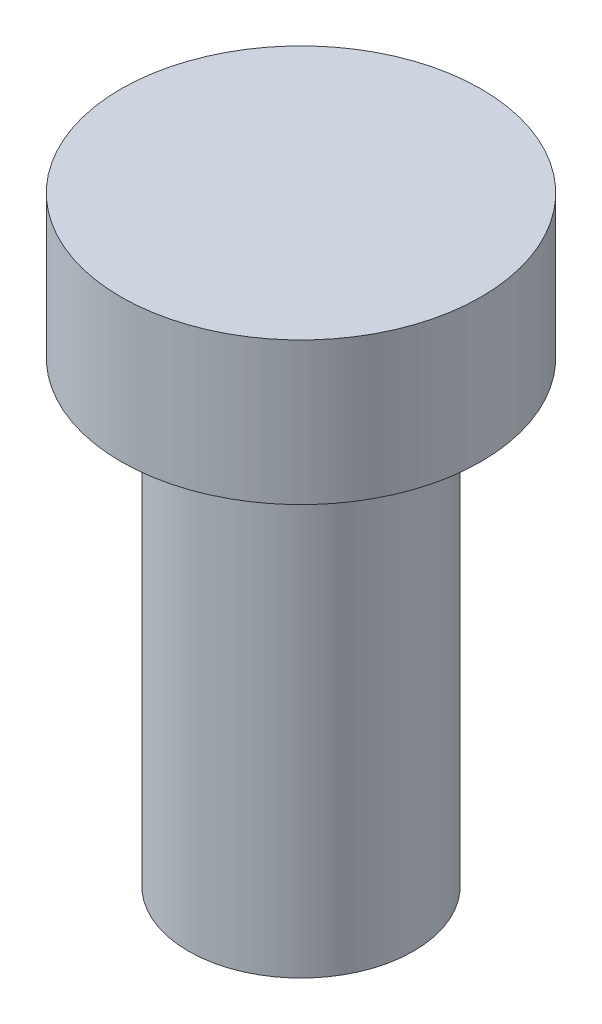
ISO-10303-21;
HEADER;
FILE_DESCRIPTION(('STEP AP214'),'2;1');
FILE_NAME('part.step','',(''),(''),'','','');
FILE_SCHEMA(('AUTOMOTIVE_DESIGN { 1 0 10303 214 1 1 1 1 }'));
ENDSEC;
DATA;
#1=APPLICATION_CONTEXT('core data for automotive mechanical design processes');
#2=APPLICATION_PROTOCOL_DEFINITION('international standard','automotive_design',2000,#1);
#3=PRODUCT_CONTEXT('',#1,'mechanical');
#4=PRODUCT('Part','Part','',(#3));
#5=PRODUCT_RELATED_PRODUCT_CATEGORY('part','',(#4));
#6=PRODUCT_DEFINITION_FORMATION('','',#4);
#7=PRODUCT_DEFINITION_CONTEXT('part definition',#1,'design');
#8=PRODUCT_DEFINITION('design','',#6,#7);
#9=PRODUCT_DEFINITION_SHAPE('','',#8);
#10=(LENGTH_UNIT() NAMED_UNIT(*) SI_UNIT(.MILLI.,.METRE.));
#11=(NAMED_UNIT(*) PLANE_ANGLE_UNIT() SI_UNIT($,.RADIAN.));
#12=(NAMED_UNIT(*) SI_UNIT($,.STERADIAN.) SOLID_ANGLE_UNIT());
#13=UNCERTAINTY_MEASURE_WITH_UNIT(LENGTH_MEASURE(1.E-05),#10,'distance_accuracy_value','');
#14=(GEOMETRIC_REPRESENTATION_CONTEXT(3) GLOBAL_UNCERTAINTY_ASSIGNED_CONTEXT((#13)) GLOBAL_UNIT_ASSIGNED_CONTEXT((#10,
#11,#12)) REPRESENTATION_CONTEXT('',''));
#15=CARTESIAN_POINT('',(0.,0.,0.));
#16=DIRECTION('',(0.,0.,1.));
#17=DIRECTION('',(1.,0.,0.));
#18=AXIS2_PLACEMENT_3D('',#15,#16,#17);
#19=CARTESIAN_POINT('',(0.,1.9,0.));
#20=DIRECTION('',(0.,-1.,0.));
#21=DIRECTION('',(0.,0.,-1.));
#22=AXIS2_PLACEMENT_3D('',#19,#20,#21);
#23=CYLINDRICAL_SURFACE('',#22,2.4);
#24=CARTESIAN_POINT('',(0.,1.9,0.));
#25=DIRECTION('',(0.,1.,0.));
#26=DIRECTION('',(0.,0.,1.));
#27=AXIS2_PLACEMENT_3D('',#24,#25,#26);
#28=CIRCLE('',#27,2.4);
#29=CARTESIAN_POINT('',(0.,1.9,-2.4));
#30=VERTEX_POINT('',#29);
#31=EDGE_CURVE('E37',#30,#30,#28,.T.);
#32=CARTESIAN_POINT('',(0.,0.,0.));
#33=DIRECTION('',(0.,1.,0.));
#34=DIRECTION('',(0.,0.,1.));
#35=AXIS2_PLACEMENT_3D('',#32,#33,#34);
#36=CIRCLE('',#35,2.4);
#37=CARTESIAN_POINT('',(0.,0.,-2.4));
#38=VERTEX_POINT('',#37);
#39=EDGE_CURVE('E33',#38,#38,#36,.T.);
#40=CARTESIAN_POINT('',(0.,1.9,-2.4));
#41=CARTESIAN_POINT('',(0.,1.88020833333333,-2.4));
#42=CARTESIAN_POINT('',(0.,1.86041666666667,-2.4));
#43=CARTESIAN_POINT('',(0.,1.82083333333333,-2.4));
#44=CARTESIAN_POINT('',(0.,1.80104166666667,-2.4));
#45=CARTESIAN_POINT('',(0.,1.76145833333333,-2.4));
#46=CARTESIAN_POINT('',(0.,1.74166666666667,-2.4));
#47=CARTESIAN_POINT('',(0.,1.70208333333333,-2.4));
#48=CARTESIAN_POINT('',(0.,1.68229166666667,-2.4));
#49=CARTESIAN_POINT('',(0.,1.64270833333333,-2.4));
#50=CARTESIAN_POINT('',(0.,1.62291666666667,-2.4));
#51=CARTESIAN_POINT('',(0.,1.58333333333333,-2.4));
#52=CARTESIAN_POINT('',(0.,1.56354166666667,-2.4));
#53=CARTESIAN_POINT('',(0.,1.52395833333333,-2.4));
#54=CARTESIAN_POINT('',(0.,1.50416666666667,-2.4));
#55=CARTESIAN_POINT('',(0.,1.46458333333333,-2.4));
#56=CARTESIAN_POINT('',(0.,1.44479166666667,-2.4));
#57=CARTESIAN_POINT('',(0.,1.40520833333333,-2.4));
#58=CARTESIAN_POINT('',(0.,1.38541666666667,-2.4));
#59=CARTESIAN_POINT('',(0.,1.34583333333333,-2.4));
#60=CARTESIAN_POINT('',(0.,1.32604166666667,-2.4));
#61=CARTESIAN_POINT('',(0.,1.28645833333333,-2.4));
#62=CARTESIAN_POINT('',(0.,1.26666666666667,-2.4));
#63=CARTESIAN_POINT('',(0.,1.22708333333333,-2.4));
#64=CARTESIAN_POINT('',(0.,1.20729166666667,-2.4));
#65=CARTESIAN_POINT('',(0.,1.16770833333333,-2.4));
#66=CARTESIAN_POINT('',(0.,1.14791666666667,-2.4));
#67=CARTESIAN_POINT('',(0.,1.10833333333333,-2.4));
#68=CARTESIAN_POINT('',(0.,1.08854166666667,-2.4));
#69=CARTESIAN_POINT('',(0.,1.04895833333333,-2.4));
#70=CARTESIAN_POINT('',(0.,1.02916666666667,-2.4));
#71=CARTESIAN_POINT('',(0.,0.989583333333333,-2.4));
#72=CARTESIAN_POINT('',(0.,0.969791666666667,-2.4));
#73=CARTESIAN_POINT('',(0.,0.930208333333333,-2.4));
#74=CARTESIAN_POINT('',(0.,0.910416666666667,-2.4));
#75=CARTESIAN_POINT('',(0.,0.870833333333333,-2.4));
#76=CARTESIAN_POINT('',(0.,0.851041666666667,-2.4));
#77=CARTESIAN_POINT('',(0.,0.811458333333333,-2.4));
#78=CARTESIAN_POINT('',(0.,0.791666666666667,-2.4));
#79=CARTESIAN_POINT('',(0.,0.752083333333333,-2.4));
#80=CARTESIAN_POINT('',(0.,0.732291666666667,-2.4));
#81=CARTESIAN_POINT('',(0.,0.692708333333333,-2.4));
#82=CARTESIAN_POINT('',(0.,0.672916666666667,-2.4));
#83=CARTESIAN_POINT('',(0.,0.633333333333333,-2.4));
#84=CARTESIAN_POINT('',(0.,0.613541666666667,-2.4));
#85=CARTESIAN_POINT('',(0.,0.573958333333333,-2.4));
#86=CARTESIAN_POINT('',(0.,0.554166666666667,-2.4));
#87=CARTESIAN_POINT('',(0.,0.514583333333333,-2.4));
#88=CARTESIAN_POINT('',(0.,0.494791666666667,-2.4));
#89=CARTESIAN_POINT('',(0.,0.455208333333333,-2.4));
#90=CARTESIAN_POINT('',(0.,0.435416666666667,-2.4));
#91=CARTESIAN_POINT('',(0.,0.395833333333333,-2.4));
#92=CARTESIAN_POINT('',(0.,0.376041666666667,-2.4));
#93=CARTESIAN_POINT('',(0.,0.336458333333333,-2.4));
#94=CARTESIAN_POINT('',(0.,0.316666666666667,-2.4));
#95=CARTESIAN_POINT('',(0.,0.277083333333333,-2.4));
#96=CARTESIAN_POINT('',(0.,0.257291666666667,-2.4));
#97=CARTESIAN_POINT('',(0.,0.217708333333333,-2.4));
#98=CARTESIAN_POINT('',(0.,0.197916666666667,-2.4));
#99=CARTESIAN_POINT('',(0.,0.158333333333333,-2.4));
#100=CARTESIAN_POINT('',(0.,0.138541666666667,-2.4));
#101=CARTESIAN_POINT('',(0.,0.0989583333333333,-2.4));
#102=CARTESIAN_POINT('',(0.,0.0791666666666666,-2.4));
#103=CARTESIAN_POINT('',(0.,0.0395833333333333,-2.4));
#104=CARTESIAN_POINT('',(0.,0.0197916666666666,-2.4));
#105=CARTESIAN_POINT('',(0.,0.,-2.4));
#106=B_SPLINE_CURVE_WITH_KNOTS('',3,(#40,#41,#42,#43,#44,#45,#46,#47,#48,#49,#50,#51,#52,#53,
#54,#55,#56,#57,#58,#59,#60,#61,#62,#63,#64,#65,#66,#67,#68,#69,#70,#71,#72,#73,#74,#75,#76,#77,
#78,#79,#80,#81,#82,#83,#84,#85,#86,#87,#88,#89,#90,#91,#92,#93,#94,#95,#96,#97,#98,#99,#100,
#101,#102,#103,#104,#105),.UNSPECIFIED.,.F.,.F.,(4,2,2,2,2,2,2,2,2,2,2,2,2,2,2,2,2,2,2,2,2,2,2,
2,2,2,2,2,2,2,2,2,4),(0.,0.059375,0.11875,0.178125,0.2375,0.296875,0.35625,0.415625,0.475,
0.534375,0.59375,0.653125,0.7125,0.771875,0.83125,0.890625,0.95,1.009375,1.06875,1.128125,
1.1875,1.246875,1.30625,1.365625,1.425,1.484375,1.54375,1.603125,1.6625,1.721875,1.78125,
1.840625,1.9),.UNSPECIFIED.);
#107=EDGE_CURVE('BSEAM30',#30,#38,#106,.T.);
#108=ORIENTED_EDGE('',*,*,#31,.F.);
#109=ORIENTED_EDGE('',*,*,#39,.T.);
#110=ORIENTED_EDGE('',*,*,#107,.T.);
#111=ORIENTED_EDGE('',*,*,#107,.F.);
#112=EDGE_LOOP('',(#108,#110,#109,#111));
#113=FACE_BOUND('',#112,.T.);
#114=ADVANCED_FACE('F30',(#113),#23,.T.);
#115=CARTESIAN_POINT('',(0.,1.9,0.));
#116=DIRECTION('',(0.,1.,0.));
#117=DIRECTION('',(0.,0.,1.));
#118=AXIS2_PLACEMENT_3D('',#115,#116,#117);
#119=PLANE('',#118);
#120=ORIENTED_EDGE('',*,*,#31,.T.);
#121=EDGE_LOOP('',(#120));
#122=FACE_BOUND('',#121,.T.);
#123=ADVANCED_FACE('F54',(#122),#119,.T.);
#124=CARTESIAN_POINT('',(0.,0.,0.));
#125=DIRECTION('',(0.,1.,0.));
#126=DIRECTION('',(0.,0.,1.));
#127=AXIS2_PLACEMENT_3D('',#124,#125,#126);
#128=PLANE('',#127);
#129=CARTESIAN_POINT('',(0.,0.,0.));
#130=DIRECTION('',(0.,-1.,0.));
#131=DIRECTION('',(0.,0.,-1.));
#132=AXIS2_PLACEMENT_3D('',#129,#130,#131);
#133=CIRCLE('',#132,1.5);
#134=CARTESIAN_POINT('',(0.,0.,-1.5));
#135=VERTEX_POINT('',#134);
#136=EDGE_CURVE('E10',#135,#135,#133,.T.);
#137=ORIENTED_EDGE('',*,*,#136,.F.);
#138=EDGE_LOOP('',(#137));
#139=FACE_BOUND('',#138,.T.);
#140=ORIENTED_EDGE('',*,*,#39,.F.);
#141=EDGE_LOOP('',(#140));
#142=FACE_BOUND('',#141,.T.);
#143=ADVANCED_FACE('F51',(#139,#142),#128,.F.);
#144=CARTESIAN_POINT('',(0.,-6.1,0.));
#145=DIRECTION('',(0.,1.,0.));
#146=DIRECTION('',(0.,0.,1.));
#147=AXIS2_PLACEMENT_3D('',#144,#145,#146);
#148=CYLINDRICAL_SURFACE('',#147,1.5);
#149=CARTESIAN_POINT('',(0.,-6.1,0.));
#150=DIRECTION('',(0.,-1.,0.));
#151=DIRECTION('',(0.,0.,-1.));
#152=AXIS2_PLACEMENT_3D('',#149,#150,#151);
#153=CIRCLE('',#152,1.5);
#154=CARTESIAN_POINT('',(0.,-6.1,-1.5));
#155=VERTEX_POINT('',#154);
#156=EDGE_CURVE('E43',#155,#155,#153,.T.);
#157=ORIENTED_EDGE('',*,*,#156,.F.);
#158=EDGE_LOOP('',(#157));
#159=FACE_BOUND('',#158,.T.);
#160=ORIENTED_EDGE('',*,*,#136,.T.);
#161=EDGE_LOOP('',(#160));
#162=FACE_BOUND('',#161,.T.);
#163=ADVANCED_FACE('F53',(#159,#162),#148,.T.);
#164=CARTESIAN_POINT('',(0.,-6.1,0.));
#165=DIRECTION('',(0.,-1.,0.));
#166=DIRECTION('',(0.,0.,-1.));
#167=AXIS2_PLACEMENT_3D('',#164,#165,#166);
#168=PLANE('',#167);
#169=ORIENTED_EDGE('',*,*,#156,.T.);
#170=EDGE_LOOP('',(#169));
#171=FACE_BOUND('',#170,.T.);
#172=ADVANCED_FACE('F60',(#171),#168,.T.);
#173=CLOSED_SHELL('',(#114,#123,#143,#163,#172));
#174=MANIFOLD_SOLID_BREP('B2',#173);
#175=ADVANCED_BREP_SHAPE_REPRESENTATION('',(#18,#174),#14);
#176=SHAPE_DEFINITION_REPRESENTATION(#9,#175);
ENDSEC;
END-ISO-10303-21;
